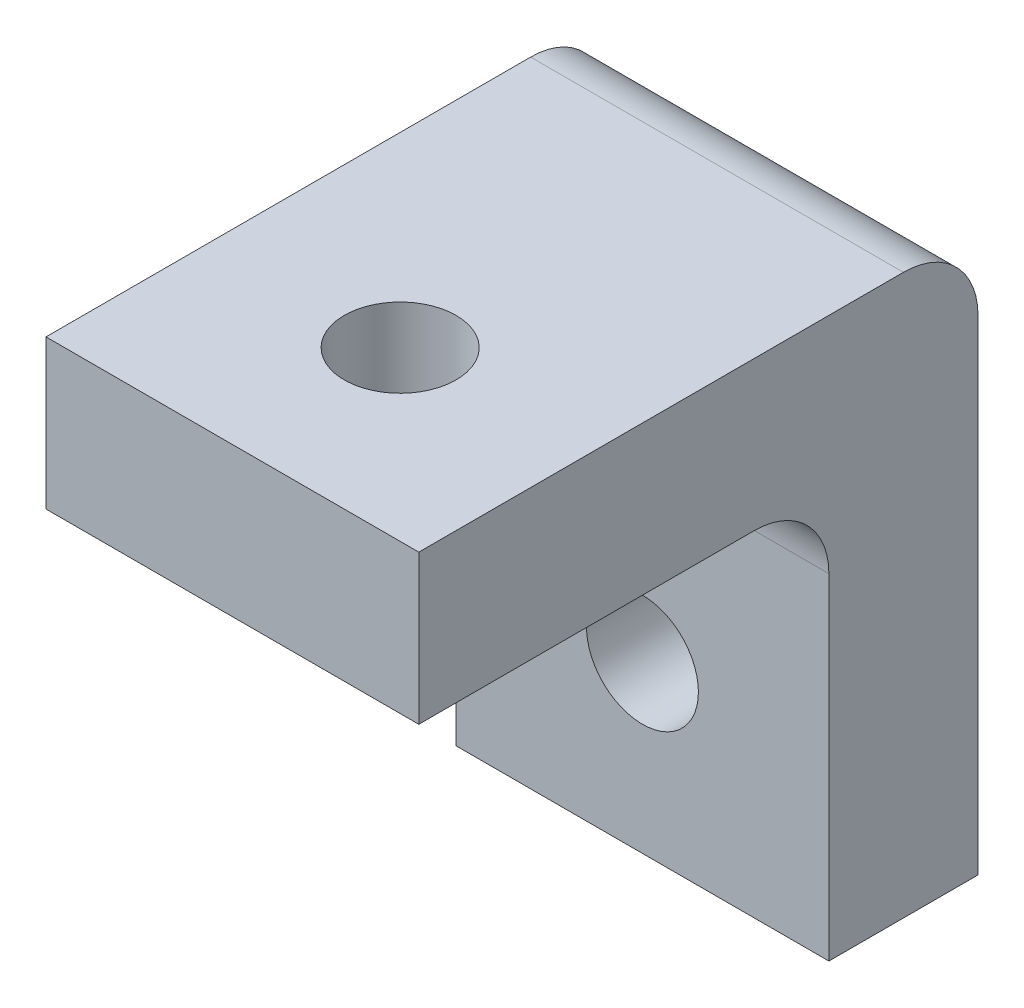
ISO-10303-21;
HEADER;
FILE_DESCRIPTION(('STEP AP214'),'2;1');
FILE_NAME('part.step','',(''),(''),'','','');
FILE_SCHEMA(('AUTOMOTIVE_DESIGN { 1 0 10303 214 1 1 1 1 }'));
ENDSEC;
DATA;
#1=APPLICATION_CONTEXT('core data for automotive mechanical design processes');
#2=APPLICATION_PROTOCOL_DEFINITION('international standard','automotive_design',2000,#1);
#3=PRODUCT_CONTEXT('',#1,'mechanical');
#4=PRODUCT('Part','Part','',(#3));
#5=PRODUCT_RELATED_PRODUCT_CATEGORY('part','',(#4));
#6=PRODUCT_DEFINITION_FORMATION('','',#4);
#7=PRODUCT_DEFINITION_CONTEXT('part definition',#1,'design');
#8=PRODUCT_DEFINITION('design','',#6,#7);
#9=PRODUCT_DEFINITION_SHAPE('','',#8);
#10=(LENGTH_UNIT() NAMED_UNIT(*) SI_UNIT(.MILLI.,.METRE.));
#11=(NAMED_UNIT(*) PLANE_ANGLE_UNIT() SI_UNIT($,.RADIAN.));
#12=(NAMED_UNIT(*) SI_UNIT($,.STERADIAN.) SOLID_ANGLE_UNIT());
#13=UNCERTAINTY_MEASURE_WITH_UNIT(LENGTH_MEASURE(1.E-05),#10,'distance_accuracy_value','');
#14=(GEOMETRIC_REPRESENTATION_CONTEXT(3) GLOBAL_UNCERTAINTY_ASSIGNED_CONTEXT((#13)) GLOBAL_UNIT_ASSIGNED_CONTEXT((#10,
#11,#12)) REPRESENTATION_CONTEXT('',''));
#15=CARTESIAN_POINT('',(0.,0.,0.));
#16=DIRECTION('',(0.,0.,1.));
#17=DIRECTION('',(1.,0.,0.));
#18=AXIS2_PLACEMENT_3D('',#15,#16,#17);
#19=CARTESIAN_POINT('',(10.,0.,0.));
#20=DIRECTION('',(0.,0.,1.));
#21=DIRECTION('',(0.,-1.,0.));
#22=AXIS2_PLACEMENT_3D('',#19,#20,#21);
#23=PLANE('',#22);
#24=CARTESIAN_POINT('',(5.,-10.5,0.));
#25=DIRECTION('',(0.,0.,1.));
#26=DIRECTION('',(1.,0.,0.));
#27=AXIS2_PLACEMENT_3D('',#24,#25,#26);
#28=CIRCLE('',#27,1.5);
#29=CARTESIAN_POINT('',(6.5,-10.5,0.));
#30=VERTEX_POINT('',#29);
#31=EDGE_CURVE('E232',#30,#30,#28,.T.);
#32=ORIENTED_EDGE('',*,*,#31,.T.);
#33=EDGE_LOOP('',(#32));
#34=FACE_BOUND('',#33,.T.);
#35=DIRECTION('',(0.,1.,0.));
#36=VECTOR('',#35,1.);
#37=CARTESIAN_POINT('',(0.,0.,0.));
#38=LINE('',#37,#36);
#39=CARTESIAN_POINT('',(0.,-15.,0.));
#40=VERTEX_POINT('',#39);
#41=CARTESIAN_POINT('',(0.,-2.,0.));
#42=VERTEX_POINT('',#41);
#43=EDGE_CURVE('E141',#40,#42,#38,.T.);
#44=ORIENTED_EDGE('',*,*,#43,.T.);
#45=DIRECTION('',(-1.,0.,0.));
#46=VECTOR('',#45,1.);
#47=CARTESIAN_POINT('',(10.,-2.,0.));
#48=LINE('',#47,#46);
#49=CARTESIAN_POINT('',(10.,-2.,0.));
#50=VERTEX_POINT('',#49);
#51=EDGE_CURVE('E49',#42,#50,#48,.F.);
#52=ORIENTED_EDGE('',*,*,#51,.T.);
#53=DIRECTION('',(0.,1.,0.));
#54=VECTOR('',#53,1.);
#55=CARTESIAN_POINT('',(10.,0.,0.));
#56=LINE('',#55,#54);
#57=CARTESIAN_POINT('',(10.,-15.,0.));
#58=VERTEX_POINT('',#57);
#59=EDGE_CURVE('E115',#58,#50,#56,.T.);
#60=ORIENTED_EDGE('',*,*,#59,.F.);
#61=DIRECTION('',(-1.,0.,0.));
#62=VECTOR('',#61,1.);
#63=CARTESIAN_POINT('',(10.,-15.,0.));
#64=LINE('',#63,#62);
#65=EDGE_CURVE('E140',#58,#40,#64,.T.);
#66=ORIENTED_EDGE('',*,*,#65,.T.);
#67=EDGE_LOOP('',(#44,#52,#60,#66));
#68=FACE_BOUND('',#67,.T.);
#69=ADVANCED_FACE('F41',(#34,#68),#23,.F.);
#70=CARTESIAN_POINT('',(10.,0.,0.));
#71=DIRECTION('',(0.,-1.,0.));
#72=DIRECTION('',(0.,0.,-1.));
#73=AXIS2_PLACEMENT_3D('',#70,#71,#72);
#74=PLANE('',#73);
#75=CARTESIAN_POINT('',(5.,0.,10.5));
#76=DIRECTION('',(0.,-1.,0.));
#77=DIRECTION('',(0.,0.,-1.));
#78=AXIS2_PLACEMENT_3D('',#75,#76,#77);
#79=CIRCLE('',#78,1.5);
#80=CARTESIAN_POINT('',(5.,0.,9.));
#81=VERTEX_POINT('',#80);
#82=EDGE_CURVE('E143',#81,#81,#79,.T.);
#83=ORIENTED_EDGE('',*,*,#82,.T.);
#84=EDGE_LOOP('',(#83));
#85=FACE_BOUND('',#84,.T.);
#86=DIRECTION('',(0.,0.,1.));
#87=VECTOR('',#86,1.);
#88=CARTESIAN_POINT('',(10.,0.,0.));
#89=LINE('',#88,#87);
#90=CARTESIAN_POINT('',(10.,0.,2.));
#91=VERTEX_POINT('',#90);
#92=CARTESIAN_POINT('',(10.,0.,15.));
#93=VERTEX_POINT('',#92);
#94=EDGE_CURVE('E105',#91,#93,#89,.T.);
#95=ORIENTED_EDGE('',*,*,#94,.F.);
#96=DIRECTION('',(-1.,0.,0.));
#97=VECTOR('',#96,1.);
#98=CARTESIAN_POINT('',(10.,0.,2.));
#99=LINE('',#98,#97);
#100=CARTESIAN_POINT('',(0.,0.,2.));
#101=VERTEX_POINT('',#100);
#102=EDGE_CURVE('E123',#91,#101,#99,.T.);
#103=ORIENTED_EDGE('',*,*,#102,.T.);
#104=DIRECTION('',(0.,0.,1.));
#105=VECTOR('',#104,1.);
#106=CARTESIAN_POINT('',(0.,0.,0.));
#107=LINE('',#106,#105);
#108=CARTESIAN_POINT('',(0.,0.,15.));
#109=VERTEX_POINT('',#108);
#110=EDGE_CURVE('E120',#101,#109,#107,.T.);
#111=ORIENTED_EDGE('',*,*,#110,.T.);
#112=DIRECTION('',(-1.,0.,0.));
#113=VECTOR('',#112,1.);
#114=CARTESIAN_POINT('',(10.,0.,15.));
#115=LINE('',#114,#113);
#116=EDGE_CURVE('E118',#93,#109,#115,.T.);
#117=ORIENTED_EDGE('',*,*,#116,.F.);
#118=EDGE_LOOP('',(#95,#103,#111,#117));
#119=FACE_BOUND('',#118,.T.);
#120=ADVANCED_FACE('F119',(#85,#119),#74,.F.);
#121=CARTESIAN_POINT('',(10.,-4.,15.));
#122=DIRECTION('',(0.,0.,-1.));
#123=DIRECTION('',(-1.,0.,0.));
#124=AXIS2_PLACEMENT_3D('',#121,#122,#123);
#125=PLANE('',#124);
#126=DIRECTION('',(0.,-1.,0.));
#127=VECTOR('',#126,1.);
#128=CARTESIAN_POINT('',(0.,-4.,15.));
#129=LINE('',#128,#127);
#130=CARTESIAN_POINT('',(0.,-4.,15.));
#131=VERTEX_POINT('',#130);
#132=EDGE_CURVE('E145',#109,#131,#129,.T.);
#133=ORIENTED_EDGE('',*,*,#132,.T.);
#134=DIRECTION('',(-1.,0.,0.));
#135=VECTOR('',#134,1.);
#136=CARTESIAN_POINT('',(10.,-4.,15.));
#137=LINE('',#136,#135);
#138=CARTESIAN_POINT('',(10.,-4.,15.));
#139=VERTEX_POINT('',#138);
#140=EDGE_CURVE('E124',#139,#131,#137,.T.);
#141=ORIENTED_EDGE('',*,*,#140,.F.);
#142=DIRECTION('',(0.,-1.,0.));
#143=VECTOR('',#142,1.);
#144=CARTESIAN_POINT('',(10.,-4.,15.));
#145=LINE('',#144,#143);
#146=EDGE_CURVE('E109',#93,#139,#145,.T.);
#147=ORIENTED_EDGE('',*,*,#146,.F.);
#148=ORIENTED_EDGE('',*,*,#116,.T.);
#149=EDGE_LOOP('',(#133,#141,#147,#148));
#150=FACE_BOUND('',#149,.T.);
#151=ADVANCED_FACE('F126',(#150),#125,.F.);
#152=CARTESIAN_POINT('',(10.,-4.,6.));
#153=DIRECTION('',(0.,1.,0.));
#154=DIRECTION('',(0.,0.,1.));
#155=AXIS2_PLACEMENT_3D('',#152,#153,#154);
#156=PLANE('',#155);
#157=CARTESIAN_POINT('',(5.,-4.,10.5));
#158=DIRECTION('',(0.,-1.,0.));
#159=DIRECTION('',(0.,0.,-1.));
#160=AXIS2_PLACEMENT_3D('',#157,#158,#159);
#161=CIRCLE('',#160,1.5);
#162=CARTESIAN_POINT('',(5.,-4.,9.));
#163=VERTEX_POINT('',#162);
#164=EDGE_CURVE('E231',#163,#163,#161,.T.);
#165=ORIENTED_EDGE('',*,*,#164,.F.);
#166=EDGE_LOOP('',(#165));
#167=FACE_BOUND('',#166,.T.);
#168=DIRECTION('',(0.,0.,-1.));
#169=VECTOR('',#168,1.);
#170=CARTESIAN_POINT('',(0.,-4.,6.));
#171=LINE('',#170,#169);
#172=CARTESIAN_POINT('',(0.,-4.,6.));
#173=VERTEX_POINT('',#172);
#174=EDGE_CURVE('E147',#131,#173,#171,.T.);
#175=ORIENTED_EDGE('',*,*,#174,.T.);
#176=DIRECTION('',(-1.,0.,0.));
#177=VECTOR('',#176,1.);
#178=CARTESIAN_POINT('',(10.,-4.,6.));
#179=LINE('',#178,#177);
#180=CARTESIAN_POINT('',(10.,-4.,6.));
#181=VERTEX_POINT('',#180);
#182=EDGE_CURVE('E163',#181,#173,#179,.T.);
#183=ORIENTED_EDGE('',*,*,#182,.F.);
#184=DIRECTION('',(0.,0.,-1.));
#185=VECTOR('',#184,1.);
#186=CARTESIAN_POINT('',(10.,-4.,6.));
#187=LINE('',#186,#185);
#188=EDGE_CURVE('E129',#139,#181,#187,.T.);
#189=ORIENTED_EDGE('',*,*,#188,.F.);
#190=ORIENTED_EDGE('',*,*,#140,.T.);
#191=EDGE_LOOP('',(#175,#183,#189,#190));
#192=FACE_BOUND('',#191,.T.);
#193=ADVANCED_FACE('F173',(#167,#192),#156,.F.);
#194=CARTESIAN_POINT('',(10.,-6.,6.));
#195=DIRECTION('',(-1.,0.,0.));
#196=DIRECTION('',(0.,0.,1.));
#197=AXIS2_PLACEMENT_3D('',#194,#195,#196);
#198=CYLINDRICAL_SURFACE('',#197,2.);
#199=CARTESIAN_POINT('',(0.,-6.,6.));
#200=DIRECTION('',(-1.,0.,0.));
#201=DIRECTION('',(0.,0.,-1.));
#202=AXIS2_PLACEMENT_3D('',#199,#200,#201);
#203=CIRCLE('',#202,2.);
#204=CARTESIAN_POINT('',(0.,-6.,4.));
#205=VERTEX_POINT('',#204);
#206=EDGE_CURVE('E149',#173,#205,#203,.T.);
#207=ORIENTED_EDGE('',*,*,#206,.T.);
#208=DIRECTION('',(-1.,0.,0.));
#209=VECTOR('',#208,1.);
#210=CARTESIAN_POINT('',(10.,-6.,4.));
#211=LINE('',#210,#209);
#212=CARTESIAN_POINT('',(10.,-6.,4.));
#213=VERTEX_POINT('',#212);
#214=EDGE_CURVE('E160',#213,#205,#211,.T.);
#215=ORIENTED_EDGE('',*,*,#214,.F.);
#216=CARTESIAN_POINT('',(10.,-6.,6.));
#217=DIRECTION('',(-1.,0.,0.));
#218=DIRECTION('',(0.,0.,-1.));
#219=AXIS2_PLACEMENT_3D('',#216,#217,#218);
#220=CIRCLE('',#219,2.);
#221=EDGE_CURVE('E131',#181,#213,#220,.T.);
#222=ORIENTED_EDGE('',*,*,#221,.F.);
#223=ORIENTED_EDGE('',*,*,#182,.T.);
#224=EDGE_LOOP('',(#207,#215,#222,#223));
#225=FACE_BOUND('',#224,.T.);
#226=ADVANCED_FACE('F180',(#225),#198,.F.);
#227=CARTESIAN_POINT('',(10.,-15.,4.));
#228=DIRECTION('',(0.,0.,-1.));
#229=DIRECTION('',(-1.,0.,0.));
#230=AXIS2_PLACEMENT_3D('',#227,#228,#229);
#231=PLANE('',#230);
#232=CARTESIAN_POINT('',(5.,-10.5,4.));
#233=DIRECTION('',(0.,0.,1.));
#234=DIRECTION('',(1.,0.,0.));
#235=AXIS2_PLACEMENT_3D('',#232,#233,#234);
#236=CIRCLE('',#235,1.5);
#237=CARTESIAN_POINT('',(6.5,-10.5,4.));
#238=VERTEX_POINT('',#237);
#239=EDGE_CURVE('E235',#238,#238,#236,.T.);
#240=ORIENTED_EDGE('',*,*,#239,.F.);
#241=EDGE_LOOP('',(#240));
#242=FACE_BOUND('',#241,.T.);
#243=DIRECTION('',(0.,-1.,0.));
#244=VECTOR('',#243,1.);
#245=CARTESIAN_POINT('',(0.,-15.,4.));
#246=LINE('',#245,#244);
#247=CARTESIAN_POINT('',(0.,-15.,4.));
#248=VERTEX_POINT('',#247);
#249=EDGE_CURVE('E151',#205,#248,#246,.T.);
#250=ORIENTED_EDGE('',*,*,#249,.T.);
#251=DIRECTION('',(-1.,0.,0.));
#252=VECTOR('',#251,1.);
#253=CARTESIAN_POINT('',(10.,-15.,4.));
#254=LINE('',#253,#252);
#255=CARTESIAN_POINT('',(10.,-15.,4.));
#256=VERTEX_POINT('',#255);
#257=EDGE_CURVE('E157',#256,#248,#254,.T.);
#258=ORIENTED_EDGE('',*,*,#257,.F.);
#259=DIRECTION('',(0.,-1.,0.));
#260=VECTOR('',#259,1.);
#261=CARTESIAN_POINT('',(10.,-15.,4.));
#262=LINE('',#261,#260);
#263=EDGE_CURVE('E136',#213,#256,#262,.T.);
#264=ORIENTED_EDGE('',*,*,#263,.F.);
#265=ORIENTED_EDGE('',*,*,#214,.T.);
#266=EDGE_LOOP('',(#250,#258,#264,#265));
#267=FACE_BOUND('',#266,.T.);
#268=ADVANCED_FACE('F183',(#242,#267),#231,.F.);
#269=CARTESIAN_POINT('',(10.,-15.,0.));
#270=DIRECTION('',(0.,1.,0.));
#271=DIRECTION('',(0.,0.,1.));
#272=AXIS2_PLACEMENT_3D('',#269,#270,#271);
#273=PLANE('',#272);
#274=DIRECTION('',(0.,0.,-1.));
#275=VECTOR('',#274,1.);
#276=CARTESIAN_POINT('',(0.,-15.,0.));
#277=LINE('',#276,#275);
#278=EDGE_CURVE('E153',#248,#40,#277,.T.);
#279=ORIENTED_EDGE('',*,*,#278,.T.);
#280=ORIENTED_EDGE('',*,*,#65,.F.);
#281=DIRECTION('',(0.,0.,-1.));
#282=VECTOR('',#281,1.);
#283=CARTESIAN_POINT('',(10.,-15.,0.));
#284=LINE('',#283,#282);
#285=EDGE_CURVE('E138',#256,#58,#284,.T.);
#286=ORIENTED_EDGE('',*,*,#285,.F.);
#287=ORIENTED_EDGE('',*,*,#257,.T.);
#288=EDGE_LOOP('',(#279,#280,#286,#287));
#289=FACE_BOUND('',#288,.T.);
#290=ADVANCED_FACE('F188',(#289),#273,.F.);
#291=CARTESIAN_POINT('',(10.,-6.,6.));
#292=DIRECTION('',(1.,0.,0.));
#293=DIRECTION('',(0.,0.,-1.));
#294=AXIS2_PLACEMENT_3D('',#291,#292,#293);
#295=PLANE('',#294);
#296=ORIENTED_EDGE('',*,*,#59,.T.);
#297=CARTESIAN_POINT('',(10.,-2.,2.));
#298=DIRECTION('',(1.,0.,0.));
#299=DIRECTION('',(0.,0.,-1.));
#300=AXIS2_PLACEMENT_3D('',#297,#298,#299);
#301=CIRCLE('',#300,2.);
#302=EDGE_CURVE('E11',#50,#91,#301,.T.);
#303=ORIENTED_EDGE('',*,*,#302,.T.);
#304=ORIENTED_EDGE('',*,*,#94,.T.);
#305=ORIENTED_EDGE('',*,*,#146,.T.);
#306=ORIENTED_EDGE('',*,*,#188,.T.);
#307=ORIENTED_EDGE('',*,*,#221,.T.);
#308=ORIENTED_EDGE('',*,*,#263,.T.);
#309=ORIENTED_EDGE('',*,*,#285,.T.);
#310=EDGE_LOOP('',(#296,#303,#304,#305,#306,#307,#308,#309));
#311=FACE_BOUND('',#310,.T.);
#312=ADVANCED_FACE('F107',(#311),#295,.T.);
#313=CARTESIAN_POINT('',(0.,-6.,6.));
#314=DIRECTION('',(1.,0.,0.));
#315=DIRECTION('',(0.,0.,-1.));
#316=AXIS2_PLACEMENT_3D('',#313,#314,#315);
#317=PLANE('',#316);
#318=ORIENTED_EDGE('',*,*,#110,.F.);
#319=CARTESIAN_POINT('',(0.,-2.,2.));
#320=DIRECTION('',(1.,0.,0.));
#321=DIRECTION('',(0.,0.,-1.));
#322=AXIS2_PLACEMENT_3D('',#319,#320,#321);
#323=CIRCLE('',#322,2.);
#324=EDGE_CURVE('E63',#101,#42,#323,.F.);
#325=ORIENTED_EDGE('',*,*,#324,.T.);
#326=ORIENTED_EDGE('',*,*,#43,.F.);
#327=ORIENTED_EDGE('',*,*,#278,.F.);
#328=ORIENTED_EDGE('',*,*,#249,.F.);
#329=ORIENTED_EDGE('',*,*,#206,.F.);
#330=ORIENTED_EDGE('',*,*,#174,.F.);
#331=ORIENTED_EDGE('',*,*,#132,.F.);
#332=EDGE_LOOP('',(#318,#325,#326,#327,#328,#329,#330,#331));
#333=FACE_BOUND('',#332,.T.);
#334=ADVANCED_FACE('F169',(#333),#317,.F.);
#335=CARTESIAN_POINT('',(5.,0.,10.5));
#336=DIRECTION('',(0.,-1.,0.));
#337=DIRECTION('',(0.,0.,-1.));
#338=AXIS2_PLACEMENT_3D('',#335,#336,#337);
#339=CYLINDRICAL_SURFACE('',#338,1.5);
#340=ORIENTED_EDGE('',*,*,#82,.F.);
#341=EDGE_LOOP('',(#340));
#342=FACE_BOUND('',#341,.T.);
#343=ORIENTED_EDGE('',*,*,#164,.T.);
#344=EDGE_LOOP('',(#343));
#345=FACE_BOUND('',#344,.T.);
#346=ADVANCED_FACE('F195',(#342,#345),#339,.F.);
#347=CARTESIAN_POINT('',(5.,-10.5,0.));
#348=DIRECTION('',(0.,0.,1.));
#349=DIRECTION('',(1.,0.,0.));
#350=AXIS2_PLACEMENT_3D('',#347,#348,#349);
#351=CYLINDRICAL_SURFACE('',#350,1.5);
#352=ORIENTED_EDGE('',*,*,#31,.F.);
#353=EDGE_LOOP('',(#352));
#354=FACE_BOUND('',#353,.T.);
#355=ORIENTED_EDGE('',*,*,#239,.T.);
#356=EDGE_LOOP('',(#355));
#357=FACE_BOUND('',#356,.T.);
#358=ADVANCED_FACE('F190',(#354,#357),#351,.F.);
#359=CARTESIAN_POINT('',(10.,-2.,2.));
#360=DIRECTION('',(-1.,0.,0.));
#361=DIRECTION('',(0.,0.,1.));
#362=AXIS2_PLACEMENT_3D('',#359,#360,#361);
#363=CYLINDRICAL_SURFACE('',#362,2.);
#364=ORIENTED_EDGE('',*,*,#302,.F.);
#365=ORIENTED_EDGE('',*,*,#51,.F.);
#366=ORIENTED_EDGE('',*,*,#324,.F.);
#367=ORIENTED_EDGE('',*,*,#102,.F.);
#368=EDGE_LOOP('',(#364,#365,#366,#367));
#369=FACE_BOUND('',#368,.T.);
#370=ADVANCED_FACE('F43',(#369),#363,.T.);
#371=CLOSED_SHELL('',(#69,#120,#151,#193,#226,#268,#290,#312,#334,#346,#358,#370));
#372=MANIFOLD_SOLID_BREP('B2',#371);
#373=ADVANCED_BREP_SHAPE_REPRESENTATION('',(#18,#372),#14);
#374=SHAPE_DEFINITION_REPRESENTATION(#9,#373);
ENDSEC;
END-ISO-10303-21;
